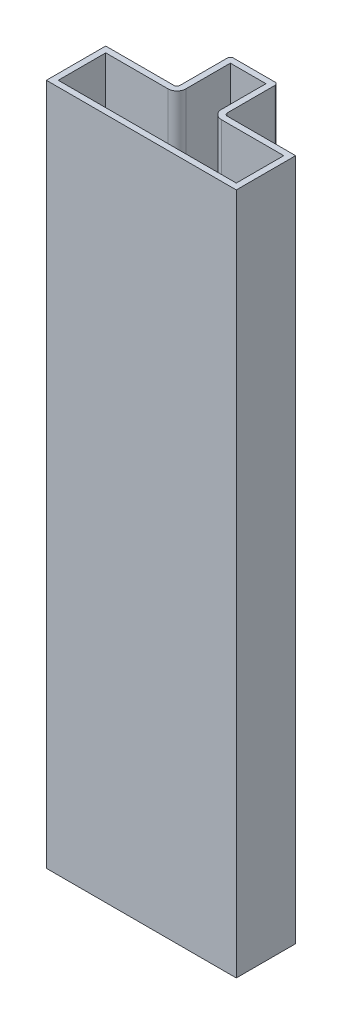
ISO-10303-21;
HEADER;
FILE_DESCRIPTION(('STEP AP214'),'2;1');
FILE_NAME('part.step','',(''),(''),'','','');
FILE_SCHEMA(('AUTOMOTIVE_DESIGN { 1 0 10303 214 1 1 1 1 }'));
ENDSEC;
DATA;
#1=APPLICATION_CONTEXT('core data for automotive mechanical design processes');
#2=APPLICATION_PROTOCOL_DEFINITION('international standard','automotive_design',2000,#1);
#3=PRODUCT_CONTEXT('',#1,'mechanical');
#4=PRODUCT('Part','Part','',(#3));
#5=PRODUCT_RELATED_PRODUCT_CATEGORY('part','',(#4));
#6=PRODUCT_DEFINITION_FORMATION('','',#4);
#7=PRODUCT_DEFINITION_CONTEXT('part definition',#1,'design');
#8=PRODUCT_DEFINITION('design','',#6,#7);
#9=PRODUCT_DEFINITION_SHAPE('','',#8);
#10=(LENGTH_UNIT() NAMED_UNIT(*) SI_UNIT(.MILLI.,.METRE.));
#11=(NAMED_UNIT(*) PLANE_ANGLE_UNIT() SI_UNIT($,.RADIAN.));
#12=(NAMED_UNIT(*) SI_UNIT($,.STERADIAN.) SOLID_ANGLE_UNIT());
#13=UNCERTAINTY_MEASURE_WITH_UNIT(LENGTH_MEASURE(1.E-05),#10,'distance_accuracy_value','');
#14=(GEOMETRIC_REPRESENTATION_CONTEXT(3) GLOBAL_UNCERTAINTY_ASSIGNED_CONTEXT((#13)) GLOBAL_UNIT_ASSIGNED_CONTEXT((#10,
#11,#12)) REPRESENTATION_CONTEXT('',''));
#15=CARTESIAN_POINT('',(0.,0.,0.));
#16=DIRECTION('',(0.,0.,1.));
#17=DIRECTION('',(1.,0.,0.));
#18=AXIS2_PLACEMENT_3D('',#15,#16,#17);
#19=CARTESIAN_POINT('',(0.,115.,-10.));
#20=DIRECTION('',(1.,0.,0.));
#21=DIRECTION('',(0.,0.,-1.));
#22=AXIS2_PLACEMENT_3D('',#19,#20,#21);
#23=PLANE('',#22);
#24=DIRECTION('',(0.,0.,1.));
#25=VECTOR('',#24,1.);
#26=CARTESIAN_POINT('',(0.,0.,-10.));
#27=LINE('',#26,#25);
#28=CARTESIAN_POINT('',(0.,0.,-10.));
#29=VERTEX_POINT('',#28);
#30=CARTESIAN_POINT('',(0.,0.,0.));
#31=VERTEX_POINT('',#30);
#32=EDGE_CURVE('E312',#29,#31,#27,.T.);
#33=ORIENTED_EDGE('',*,*,#32,.T.);
#34=DIRECTION('',(0.,-1.,0.));
#35=VECTOR('',#34,1.);
#36=CARTESIAN_POINT('',(0.,115.,0.));
#37=LINE('',#36,#35);
#38=CARTESIAN_POINT('',(0.,115.,0.));
#39=VERTEX_POINT('',#38);
#40=EDGE_CURVE('E372',#39,#31,#37,.T.);
#41=ORIENTED_EDGE('',*,*,#40,.F.);
#42=DIRECTION('',(0.,0.,1.));
#43=VECTOR('',#42,1.);
#44=CARTESIAN_POINT('',(0.,115.,-10.));
#45=LINE('',#44,#43);
#46=CARTESIAN_POINT('',(0.,115.,-10.));
#47=VERTEX_POINT('',#46);
#48=EDGE_CURVE('E322',#47,#39,#45,.T.);
#49=ORIENTED_EDGE('',*,*,#48,.F.);
#50=DIRECTION('',(0.,-1.,0.));
#51=VECTOR('',#50,1.);
#52=CARTESIAN_POINT('',(0.,115.,-10.));
#53=LINE('',#52,#51);
#54=EDGE_CURVE('E344',#47,#29,#53,.T.);
#55=ORIENTED_EDGE('',*,*,#54,.T.);
#56=EDGE_LOOP('',(#33,#41,#49,#55));
#57=FACE_BOUND('',#56,.T.);
#58=ADVANCED_FACE('F39',(#57),#23,.F.);
#59=CARTESIAN_POINT('',(0.,115.,0.));
#60=DIRECTION('',(0.,0.,-1.));
#61=DIRECTION('',(-1.,0.,0.));
#62=AXIS2_PLACEMENT_3D('',#59,#60,#61);
#63=PLANE('',#62);
#64=DIRECTION('',(1.,0.,0.));
#65=VECTOR('',#64,1.);
#66=CARTESIAN_POINT('',(0.,0.,0.));
#67=LINE('',#66,#65);
#68=CARTESIAN_POINT('',(32.,0.,0.));
#69=VERTEX_POINT('',#68);
#70=EDGE_CURVE('E347',#31,#69,#67,.T.);
#71=ORIENTED_EDGE('',*,*,#70,.T.);
#72=DIRECTION('',(0.,-1.,0.));
#73=VECTOR('',#72,1.);
#74=CARTESIAN_POINT('',(32.,115.,0.));
#75=LINE('',#74,#73);
#76=CARTESIAN_POINT('',(32.,115.,0.));
#77=VERTEX_POINT('',#76);
#78=EDGE_CURVE('E369',#77,#69,#75,.T.);
#79=ORIENTED_EDGE('',*,*,#78,.F.);
#80=DIRECTION('',(1.,0.,0.));
#81=VECTOR('',#80,1.);
#82=CARTESIAN_POINT('',(0.,115.,0.));
#83=LINE('',#82,#81);
#84=EDGE_CURVE('E325',#39,#77,#83,.T.);
#85=ORIENTED_EDGE('',*,*,#84,.F.);
#86=ORIENTED_EDGE('',*,*,#40,.T.);
#87=EDGE_LOOP('',(#71,#79,#85,#86));
#88=FACE_BOUND('',#87,.T.);
#89=ADVANCED_FACE('F459',(#88),#63,.F.);
#90=CARTESIAN_POINT('',(32.,115.,0.));
#91=DIRECTION('',(-1.,0.,0.));
#92=DIRECTION('',(0.,0.,1.));
#93=AXIS2_PLACEMENT_3D('',#90,#91,#92);
#94=PLANE('',#93);
#95=DIRECTION('',(0.,0.,-1.));
#96=VECTOR('',#95,1.);
#97=CARTESIAN_POINT('',(32.,0.,0.));
#98=LINE('',#97,#96);
#99=CARTESIAN_POINT('',(32.,0.,-10.));
#100=VERTEX_POINT('',#99);
#101=EDGE_CURVE('E349',#69,#100,#98,.T.);
#102=ORIENTED_EDGE('',*,*,#101,.T.);
#103=DIRECTION('',(0.,-1.,0.));
#104=VECTOR('',#103,1.);
#105=CARTESIAN_POINT('',(32.,115.,-10.));
#106=LINE('',#105,#104);
#107=CARTESIAN_POINT('',(32.,115.,-10.));
#108=VERTEX_POINT('',#107);
#109=EDGE_CURVE('E366',#108,#100,#106,.T.);
#110=ORIENTED_EDGE('',*,*,#109,.F.);
#111=DIRECTION('',(0.,0.,-1.));
#112=VECTOR('',#111,1.);
#113=CARTESIAN_POINT('',(32.,115.,0.));
#114=LINE('',#113,#112);
#115=EDGE_CURVE('E328',#77,#108,#114,.T.);
#116=ORIENTED_EDGE('',*,*,#115,.F.);
#117=ORIENTED_EDGE('',*,*,#78,.T.);
#118=EDGE_LOOP('',(#102,#110,#116,#117));
#119=FACE_BOUND('',#118,.T.);
#120=ADVANCED_FACE('F461',(#119),#94,.F.);
#121=CARTESIAN_POINT('',(32.,115.,-10.));
#122=DIRECTION('',(0.,0.,1.));
#123=DIRECTION('',(1.,0.,0.));
#124=AXIS2_PLACEMENT_3D('',#121,#122,#123);
#125=PLANE('',#124);
#126=DIRECTION('',(-1.,0.,0.));
#127=VECTOR('',#126,1.);
#128=CARTESIAN_POINT('',(32.,0.,-10.));
#129=LINE('',#128,#127);
#130=CARTESIAN_POINT('',(20.5,0.,-10.));
#131=VERTEX_POINT('',#130);
#132=EDGE_CURVE('E351',#100,#131,#129,.T.);
#133=ORIENTED_EDGE('',*,*,#132,.T.);
#134=DIRECTION('',(0.,-1.,0.));
#135=VECTOR('',#134,1.);
#136=CARTESIAN_POINT('',(20.5,115.,-10.));
#137=LINE('',#136,#135);
#138=CARTESIAN_POINT('',(20.5,115.,-10.));
#139=VERTEX_POINT('',#138);
#140=EDGE_CURVE('E388',#131,#139,#137,.F.);
#141=ORIENTED_EDGE('',*,*,#140,.T.);
#142=DIRECTION('',(-1.,0.,0.));
#143=VECTOR('',#142,1.);
#144=CARTESIAN_POINT('',(32.,115.,-10.));
#145=LINE('',#144,#143);
#146=EDGE_CURVE('E330',#108,#139,#145,.T.);
#147=ORIENTED_EDGE('',*,*,#146,.F.);
#148=ORIENTED_EDGE('',*,*,#109,.T.);
#149=EDGE_LOOP('',(#133,#141,#147,#148));
#150=FACE_BOUND('',#149,.T.);
#151=ADVANCED_FACE('F416',(#150),#125,.F.);
#152=CARTESIAN_POINT('',(20.,115.,-10.));
#153=DIRECTION('',(-1.,0.,0.));
#154=DIRECTION('',(0.,0.,1.));
#155=AXIS2_PLACEMENT_3D('',#152,#153,#154);
#156=PLANE('',#155);
#157=DIRECTION('',(0.,0.,-1.));
#158=VECTOR('',#157,1.);
#159=CARTESIAN_POINT('',(20.,115.,-10.));
#160=LINE('',#159,#158);
#161=CARTESIAN_POINT('',(20.,115.,-10.5));
#162=VERTEX_POINT('',#161);
#163=CARTESIAN_POINT('',(20.,115.,-18.5));
#164=VERTEX_POINT('',#163);
#165=EDGE_CURVE('E333',#162,#164,#160,.T.);
#166=ORIENTED_EDGE('',*,*,#165,.F.);
#167=DIRECTION('',(0.,-1.,0.));
#168=VECTOR('',#167,1.);
#169=CARTESIAN_POINT('',(20.,0.,-10.5));
#170=LINE('',#169,#168);
#171=CARTESIAN_POINT('',(20.,0.,-10.5));
#172=VERTEX_POINT('',#171);
#173=EDGE_CURVE('E385',#162,#172,#170,.T.);
#174=ORIENTED_EDGE('',*,*,#173,.T.);
#175=DIRECTION('',(0.,0.,-1.));
#176=VECTOR('',#175,1.);
#177=CARTESIAN_POINT('',(20.,0.,-10.));
#178=LINE('',#177,#176);
#179=CARTESIAN_POINT('',(20.,0.,-18.5));
#180=VERTEX_POINT('',#179);
#181=EDGE_CURVE('E354',#172,#180,#178,.T.);
#182=ORIENTED_EDGE('',*,*,#181,.T.);
#183=DIRECTION('',(0.,-1.,0.));
#184=VECTOR('',#183,1.);
#185=CARTESIAN_POINT('',(20.,115.,-18.5));
#186=LINE('',#185,#184);
#187=EDGE_CURVE('E383',#180,#164,#186,.F.);
#188=ORIENTED_EDGE('',*,*,#187,.T.);
#189=EDGE_LOOP('',(#166,#174,#182,#188));
#190=FACE_BOUND('',#189,.T.);
#191=ADVANCED_FACE('F426',(#190),#156,.F.);
#192=CARTESIAN_POINT('',(20.,115.,-19.));
#193=DIRECTION('',(0.,0.,1.));
#194=DIRECTION('',(1.,0.,0.));
#195=AXIS2_PLACEMENT_3D('',#192,#193,#194);
#196=PLANE('',#195);
#197=DIRECTION('',(-1.,0.,0.));
#198=VECTOR('',#197,1.);
#199=CARTESIAN_POINT('',(20.,0.,-19.));
#200=LINE('',#199,#198);
#201=CARTESIAN_POINT('',(19.5,0.,-19.));
#202=VERTEX_POINT('',#201);
#203=CARTESIAN_POINT('',(12.5,0.,-19.));
#204=VERTEX_POINT('',#203);
#205=EDGE_CURVE('E357',#202,#204,#200,.T.);
#206=ORIENTED_EDGE('',*,*,#205,.T.);
#207=DIRECTION('',(0.,-1.,0.));
#208=VECTOR('',#207,1.);
#209=CARTESIAN_POINT('',(12.5,115.,-19.));
#210=LINE('',#209,#208);
#211=CARTESIAN_POINT('',(12.5,115.,-19.));
#212=VERTEX_POINT('',#211);
#213=EDGE_CURVE('E397',#204,#212,#210,.F.);
#214=ORIENTED_EDGE('',*,*,#213,.T.);
#215=DIRECTION('',(-1.,0.,0.));
#216=VECTOR('',#215,1.);
#217=CARTESIAN_POINT('',(20.,115.,-19.));
#218=LINE('',#217,#216);
#219=CARTESIAN_POINT('',(19.5,115.,-19.));
#220=VERTEX_POINT('',#219);
#221=EDGE_CURVE('E336',#220,#212,#218,.T.);
#222=ORIENTED_EDGE('',*,*,#221,.F.);
#223=DIRECTION('',(0.,-1.,0.));
#224=VECTOR('',#223,1.);
#225=CARTESIAN_POINT('',(19.5,115.,-19.));
#226=LINE('',#225,#224);
#227=EDGE_CURVE('E394',#220,#202,#226,.T.);
#228=ORIENTED_EDGE('',*,*,#227,.T.);
#229=EDGE_LOOP('',(#206,#214,#222,#228));
#230=FACE_BOUND('',#229,.T.);
#231=ADVANCED_FACE('F433',(#230),#196,.F.);
#232=CARTESIAN_POINT('',(12.,115.,-19.));
#233=DIRECTION('',(1.,0.,0.));
#234=DIRECTION('',(0.,0.,-1.));
#235=AXIS2_PLACEMENT_3D('',#232,#233,#234);
#236=PLANE('',#235);
#237=DIRECTION('',(0.,0.,1.));
#238=VECTOR('',#237,1.);
#239=CARTESIAN_POINT('',(12.,0.,-19.));
#240=LINE('',#239,#238);
#241=CARTESIAN_POINT('',(12.,0.,-18.5));
#242=VERTEX_POINT('',#241);
#243=CARTESIAN_POINT('',(12.,0.,-10.5));
#244=VERTEX_POINT('',#243);
#245=EDGE_CURVE('E360',#242,#244,#240,.T.);
#246=ORIENTED_EDGE('',*,*,#245,.T.);
#247=DIRECTION('',(0.,-1.,0.));
#248=VECTOR('',#247,1.);
#249=CARTESIAN_POINT('',(12.,115.,-10.5));
#250=LINE('',#249,#248);
#251=CARTESIAN_POINT('',(12.,115.,-10.5));
#252=VERTEX_POINT('',#251);
#253=EDGE_CURVE('E381',#244,#252,#250,.F.);
#254=ORIENTED_EDGE('',*,*,#253,.T.);
#255=DIRECTION('',(0.,0.,1.));
#256=VECTOR('',#255,1.);
#257=CARTESIAN_POINT('',(12.,115.,-19.));
#258=LINE('',#257,#256);
#259=CARTESIAN_POINT('',(12.,115.,-18.5));
#260=VERTEX_POINT('',#259);
#261=EDGE_CURVE('E339',#260,#252,#258,.T.);
#262=ORIENTED_EDGE('',*,*,#261,.F.);
#263=DIRECTION('',(0.,-1.,0.));
#264=VECTOR('',#263,1.);
#265=CARTESIAN_POINT('',(12.,115.,-18.5));
#266=LINE('',#265,#264);
#267=EDGE_CURVE('E378',#260,#242,#266,.T.);
#268=ORIENTED_EDGE('',*,*,#267,.T.);
#269=EDGE_LOOP('',(#246,#254,#262,#268));
#270=FACE_BOUND('',#269,.T.);
#271=ADVANCED_FACE('F442',(#270),#236,.F.);
#272=CARTESIAN_POINT('',(12.,115.,-10.));
#273=DIRECTION('',(0.,0.,1.));
#274=DIRECTION('',(1.,0.,0.));
#275=AXIS2_PLACEMENT_3D('',#272,#273,#274);
#276=PLANE('',#275);
#277=DIRECTION('',(-1.,0.,0.));
#278=VECTOR('',#277,1.);
#279=CARTESIAN_POINT('',(12.,115.,-10.));
#280=LINE('',#279,#278);
#281=CARTESIAN_POINT('',(11.5,115.,-10.));
#282=VERTEX_POINT('',#281);
#283=EDGE_CURVE('E342',#282,#47,#280,.T.);
#284=ORIENTED_EDGE('',*,*,#283,.F.);
#285=DIRECTION('',(0.,-1.,0.));
#286=VECTOR('',#285,1.);
#287=CARTESIAN_POINT('',(11.5,0.,-10.));
#288=LINE('',#287,#286);
#289=CARTESIAN_POINT('',(11.5,0.,-10.));
#290=VERTEX_POINT('',#289);
#291=EDGE_CURVE('E375',#282,#290,#288,.T.);
#292=ORIENTED_EDGE('',*,*,#291,.T.);
#293=DIRECTION('',(-1.,0.,0.));
#294=VECTOR('',#293,1.);
#295=CARTESIAN_POINT('',(12.,0.,-10.));
#296=LINE('',#295,#294);
#297=EDGE_CURVE('E326',#290,#29,#296,.T.);
#298=ORIENTED_EDGE('',*,*,#297,.T.);
#299=ORIENTED_EDGE('',*,*,#54,.F.);
#300=EDGE_LOOP('',(#284,#292,#298,#299));
#301=FACE_BOUND('',#300,.T.);
#302=ADVANCED_FACE('F450',(#301),#276,.F.);
#303=CARTESIAN_POINT('',(0.,115.,0.));
#304=DIRECTION('',(0.,1.,0.));
#305=DIRECTION('',(0.,0.,1.));
#306=AXIS2_PLACEMENT_3D('',#303,#304,#305);
#307=PLANE('',#306);
#308=DIRECTION('',(-1.,0.,0.));
#309=VECTOR('',#308,1.);
#310=CARTESIAN_POINT('',(20.,115.,-18.));
#311=LINE('',#310,#309);
#312=CARTESIAN_POINT('',(19.,115.,-18.));
#313=VERTEX_POINT('',#312);
#314=CARTESIAN_POINT('',(13.,115.,-18.));
#315=VERTEX_POINT('',#314);
#316=EDGE_CURVE('E314',#313,#315,#311,.T.);
#317=ORIENTED_EDGE('',*,*,#316,.F.);
#318=DIRECTION('',(0.,0.,-1.));
#319=VECTOR('',#318,1.);
#320=CARTESIAN_POINT('',(19.,115.,-10.));
#321=LINE('',#320,#319);
#322=CARTESIAN_POINT('',(19.,115.,-10.5));
#323=VERTEX_POINT('',#322);
#324=EDGE_CURVE('E310',#323,#313,#321,.T.);
#325=ORIENTED_EDGE('',*,*,#324,.F.);
#326=CARTESIAN_POINT('',(20.5,115.,-10.5));
#327=DIRECTION('',(0.,1.,0.));
#328=DIRECTION('',(0.,0.,1.));
#329=AXIS2_PLACEMENT_3D('',#326,#327,#328);
#330=CIRCLE('',#329,1.5);
#331=CARTESIAN_POINT('',(20.5,115.,-9.));
#332=VERTEX_POINT('',#331);
#333=EDGE_CURVE('E288',#332,#323,#330,.F.);
#334=ORIENTED_EDGE('',*,*,#333,.F.);
#335=DIRECTION('',(-1.,0.,0.));
#336=VECTOR('',#335,1.);
#337=CARTESIAN_POINT('',(32.,115.,-9.));
#338=LINE('',#337,#336);
#339=CARTESIAN_POINT('',(31.,115.,-9.));
#340=VERTEX_POINT('',#339);
#341=EDGE_CURVE('E307',#340,#332,#338,.T.);
#342=ORIENTED_EDGE('',*,*,#341,.F.);
#343=DIRECTION('',(0.,0.,-1.));
#344=VECTOR('',#343,1.);
#345=CARTESIAN_POINT('',(31.,115.,0.));
#346=LINE('',#345,#344);
#347=CARTESIAN_POINT('',(31.,115.,-1.));
#348=VERTEX_POINT('',#347);
#349=EDGE_CURVE('E305',#348,#340,#346,.T.);
#350=ORIENTED_EDGE('',*,*,#349,.F.);
#351=DIRECTION('',(1.,0.,0.));
#352=VECTOR('',#351,1.);
#353=CARTESIAN_POINT('',(0.,115.,-1.));
#354=LINE('',#353,#352);
#355=CARTESIAN_POINT('',(1.,115.,-1.));
#356=VERTEX_POINT('',#355);
#357=EDGE_CURVE('E303',#356,#348,#354,.T.);
#358=ORIENTED_EDGE('',*,*,#357,.F.);
#359=DIRECTION('',(0.,0.,1.));
#360=VECTOR('',#359,1.);
#361=CARTESIAN_POINT('',(1.00000000000002,115.,-10.));
#362=LINE('',#361,#360);
#363=CARTESIAN_POINT('',(1.00000000000002,115.,-9.));
#364=VERTEX_POINT('',#363);
#365=EDGE_CURVE('E291',#364,#356,#362,.T.);
#366=ORIENTED_EDGE('',*,*,#365,.F.);
#367=DIRECTION('',(-1.,0.,0.));
#368=VECTOR('',#367,1.);
#369=CARTESIAN_POINT('',(12.,115.,-9.));
#370=LINE('',#369,#368);
#371=CARTESIAN_POINT('',(11.5,115.,-9.));
#372=VERTEX_POINT('',#371);
#373=EDGE_CURVE('E264',#372,#364,#370,.T.);
#374=ORIENTED_EDGE('',*,*,#373,.F.);
#375=CARTESIAN_POINT('',(11.5,115.,-10.5));
#376=DIRECTION('',(0.,1.,0.));
#377=DIRECTION('',(0.,0.,1.));
#378=AXIS2_PLACEMENT_3D('',#375,#376,#377);
#379=CIRCLE('',#378,1.5);
#380=CARTESIAN_POINT('',(13.,115.,-10.5));
#381=VERTEX_POINT('',#380);
#382=EDGE_CURVE('E289',#381,#372,#379,.F.);
#383=ORIENTED_EDGE('',*,*,#382,.F.);
#384=DIRECTION('',(0.,0.,1.));
#385=VECTOR('',#384,1.);
#386=CARTESIAN_POINT('',(13.,115.,-19.));
#387=LINE('',#386,#385);
#388=EDGE_CURVE('E317',#315,#381,#387,.T.);
#389=ORIENTED_EDGE('',*,*,#388,.F.);
#390=EDGE_LOOP('',(#317,#325,#334,#342,#350,#358,#366,#374,#383,#389));
#391=FACE_BOUND('',#390,.T.);
#392=ORIENTED_EDGE('',*,*,#221,.T.);
#393=CARTESIAN_POINT('',(12.5,115.,-18.5));
#394=DIRECTION('',(0.,1.,0.));
#395=DIRECTION('',(0.,0.,1.));
#396=AXIS2_PLACEMENT_3D('',#393,#394,#395);
#397=CIRCLE('',#396,0.5);
#398=EDGE_CURVE('E401',#212,#260,#397,.T.);
#399=ORIENTED_EDGE('',*,*,#398,.T.);
#400=ORIENTED_EDGE('',*,*,#261,.T.);
#401=CARTESIAN_POINT('',(11.5,115.,-10.5));
#402=DIRECTION('',(0.,1.,0.));
#403=DIRECTION('',(0.,0.,1.));
#404=AXIS2_PLACEMENT_3D('',#401,#402,#403);
#405=CIRCLE('',#404,0.5);
#406=EDGE_CURVE('E405',#252,#282,#405,.F.);
#407=ORIENTED_EDGE('',*,*,#406,.T.);
#408=ORIENTED_EDGE('',*,*,#283,.T.);
#409=ORIENTED_EDGE('',*,*,#48,.T.);
#410=ORIENTED_EDGE('',*,*,#84,.T.);
#411=ORIENTED_EDGE('',*,*,#115,.T.);
#412=ORIENTED_EDGE('',*,*,#146,.T.);
#413=CARTESIAN_POINT('',(20.5,115.,-10.5));
#414=DIRECTION('',(0.,1.,0.));
#415=DIRECTION('',(0.,0.,1.));
#416=AXIS2_PLACEMENT_3D('',#413,#414,#415);
#417=CIRCLE('',#416,0.5);
#418=EDGE_CURVE('E11',#139,#162,#417,.F.);
#419=ORIENTED_EDGE('',*,*,#418,.T.);
#420=ORIENTED_EDGE('',*,*,#165,.T.);
#421=CARTESIAN_POINT('',(19.5,115.,-18.5));
#422=DIRECTION('',(0.,1.,0.));
#423=DIRECTION('',(0.,0.,1.));
#424=AXIS2_PLACEMENT_3D('',#421,#422,#423);
#425=CIRCLE('',#424,0.5);
#426=EDGE_CURVE('E399',#164,#220,#425,.T.);
#427=ORIENTED_EDGE('',*,*,#426,.T.);
#428=EDGE_LOOP('',(#392,#399,#400,#407,#408,#409,#410,#411,#412,#419,#420,#427));
#429=FACE_BOUND('',#428,.T.);
#430=ADVANCED_FACE('F423',(#391,#429),#307,.T.);
#431=CARTESIAN_POINT('',(0.,0.,0.));
#432=DIRECTION('',(0.,1.,0.));
#433=DIRECTION('',(0.,0.,1.));
#434=AXIS2_PLACEMENT_3D('',#431,#432,#433);
#435=PLANE('',#434);
#436=DIRECTION('',(-1.,0.,0.));
#437=VECTOR('',#436,1.);
#438=CARTESIAN_POINT('',(14.5,0.,-3.));
#439=LINE('',#438,#437);
#440=CARTESIAN_POINT('',(17.5,0.,-3.));
#441=VERTEX_POINT('',#440);
#442=CARTESIAN_POINT('',(14.5,0.,-3.));
#443=VERTEX_POINT('',#442);
#444=EDGE_CURVE('E242',#441,#443,#439,.T.);
#445=ORIENTED_EDGE('',*,*,#444,.F.);
#446=DIRECTION('',(0.,0.,1.));
#447=VECTOR('',#446,1.);
#448=CARTESIAN_POINT('',(17.5,0.,-3.));
#449=LINE('',#448,#447);
#450=CARTESIAN_POINT('',(17.5,0.,-7.));
#451=VERTEX_POINT('',#450);
#452=EDGE_CURVE('E54',#451,#441,#449,.T.);
#453=ORIENTED_EDGE('',*,*,#452,.F.);
#454=DIRECTION('',(1.,0.,0.));
#455=VECTOR('',#454,1.);
#456=CARTESIAN_POINT('',(14.5,0.,-7.));
#457=LINE('',#456,#455);
#458=CARTESIAN_POINT('',(14.5,0.,-7.));
#459=VERTEX_POINT('',#458);
#460=EDGE_CURVE('E233',#459,#451,#457,.T.);
#461=ORIENTED_EDGE('',*,*,#460,.F.);
#462=DIRECTION('',(0.,0.,-1.));
#463=VECTOR('',#462,1.);
#464=CARTESIAN_POINT('',(14.5,0.,-3.));
#465=LINE('',#464,#463);
#466=EDGE_CURVE('E236',#443,#459,#465,.T.);
#467=ORIENTED_EDGE('',*,*,#466,.F.);
#468=EDGE_LOOP('',(#445,#453,#461,#467));
#469=FACE_BOUND('',#468,.T.);
#470=ORIENTED_EDGE('',*,*,#245,.F.);
#471=CARTESIAN_POINT('',(12.5,0.,-18.5));
#472=DIRECTION('',(0.,1.,0.));
#473=DIRECTION('',(0.,0.,1.));
#474=AXIS2_PLACEMENT_3D('',#471,#472,#473);
#475=CIRCLE('',#474,0.5);
#476=EDGE_CURVE('E392',#242,#204,#475,.F.);
#477=ORIENTED_EDGE('',*,*,#476,.T.);
#478=ORIENTED_EDGE('',*,*,#205,.F.);
#479=CARTESIAN_POINT('',(19.5,0.,-18.5));
#480=DIRECTION('',(0.,1.,0.));
#481=DIRECTION('',(0.,0.,1.));
#482=AXIS2_PLACEMENT_3D('',#479,#480,#481);
#483=CIRCLE('',#482,0.5);
#484=EDGE_CURVE('E390',#202,#180,#483,.F.);
#485=ORIENTED_EDGE('',*,*,#484,.T.);
#486=ORIENTED_EDGE('',*,*,#181,.F.);
#487=CARTESIAN_POINT('',(20.5,0.,-10.5));
#488=DIRECTION('',(0.,1.,0.));
#489=DIRECTION('',(0.,0.,1.));
#490=AXIS2_PLACEMENT_3D('',#487,#488,#489);
#491=CIRCLE('',#490,0.5);
#492=EDGE_CURVE('E47',#172,#131,#491,.T.);
#493=ORIENTED_EDGE('',*,*,#492,.T.);
#494=ORIENTED_EDGE('',*,*,#132,.F.);
#495=ORIENTED_EDGE('',*,*,#101,.F.);
#496=ORIENTED_EDGE('',*,*,#70,.F.);
#497=ORIENTED_EDGE('',*,*,#32,.F.);
#498=ORIENTED_EDGE('',*,*,#297,.F.);
#499=CARTESIAN_POINT('',(11.5,0.,-10.5));
#500=DIRECTION('',(0.,1.,0.));
#501=DIRECTION('',(0.,0.,1.));
#502=AXIS2_PLACEMENT_3D('',#499,#500,#501);
#503=CIRCLE('',#502,0.5);
#504=EDGE_CURVE('E403',#290,#244,#503,.T.);
#505=ORIENTED_EDGE('',*,*,#504,.T.);
#506=EDGE_LOOP('',(#470,#477,#478,#485,#486,#493,#494,#495,#496,#497,#498,#505));
#507=FACE_BOUND('',#506,.T.);
#508=ADVANCED_FACE('F410',(#469,#507),#435,.F.);
#509=CARTESIAN_POINT('',(11.5,115.,-10.5));
#510=DIRECTION('',(0.,1.,0.));
#511=DIRECTION('',(0.,0.,1.));
#512=AXIS2_PLACEMENT_3D('',#509,#510,#511);
#513=CYLINDRICAL_SURFACE('',#512,0.5);
#514=ORIENTED_EDGE('',*,*,#406,.F.);
#515=ORIENTED_EDGE('',*,*,#253,.F.);
#516=ORIENTED_EDGE('',*,*,#504,.F.);
#517=ORIENTED_EDGE('',*,*,#291,.F.);
#518=EDGE_LOOP('',(#514,#515,#516,#517));
#519=FACE_BOUND('',#518,.T.);
#520=ADVANCED_FACE('F445',(#519),#513,.F.);
#521=CARTESIAN_POINT('',(20.5,115.,-10.5));
#522=DIRECTION('',(0.,1.,0.));
#523=DIRECTION('',(0.,0.,1.));
#524=AXIS2_PLACEMENT_3D('',#521,#522,#523);
#525=CYLINDRICAL_SURFACE('',#524,0.5);
#526=ORIENTED_EDGE('',*,*,#418,.F.);
#527=ORIENTED_EDGE('',*,*,#140,.F.);
#528=ORIENTED_EDGE('',*,*,#492,.F.);
#529=ORIENTED_EDGE('',*,*,#173,.F.);
#530=EDGE_LOOP('',(#526,#527,#528,#529));
#531=FACE_BOUND('',#530,.T.);
#532=ADVANCED_FACE('F420',(#531),#525,.F.);
#533=CARTESIAN_POINT('',(12.5,115.,-18.5));
#534=DIRECTION('',(0.,-1.,0.));
#535=DIRECTION('',(0.,0.,-1.));
#536=AXIS2_PLACEMENT_3D('',#533,#534,#535);
#537=CYLINDRICAL_SURFACE('',#536,0.5);
#538=ORIENTED_EDGE('',*,*,#398,.F.);
#539=ORIENTED_EDGE('',*,*,#213,.F.);
#540=ORIENTED_EDGE('',*,*,#476,.F.);
#541=ORIENTED_EDGE('',*,*,#267,.F.);
#542=EDGE_LOOP('',(#538,#539,#540,#541));
#543=FACE_BOUND('',#542,.T.);
#544=ADVANCED_FACE('F437',(#543),#537,.T.);
#545=CARTESIAN_POINT('',(19.5,115.,-18.5));
#546=DIRECTION('',(0.,-1.,0.));
#547=DIRECTION('',(0.,0.,-1.));
#548=AXIS2_PLACEMENT_3D('',#545,#546,#547);
#549=CYLINDRICAL_SURFACE('',#548,0.5);
#550=ORIENTED_EDGE('',*,*,#426,.F.);
#551=ORIENTED_EDGE('',*,*,#187,.F.);
#552=ORIENTED_EDGE('',*,*,#484,.F.);
#553=ORIENTED_EDGE('',*,*,#227,.F.);
#554=EDGE_LOOP('',(#550,#551,#552,#553));
#555=FACE_BOUND('',#554,.T.);
#556=ADVANCED_FACE('F41',(#555),#549,.T.);
#557=CARTESIAN_POINT('',(1.00000000000002,115.,-10.));
#558=DIRECTION('',(1.,0.,0.));
#559=DIRECTION('',(0.,0.,-1.));
#560=AXIS2_PLACEMENT_3D('',#557,#558,#559);
#561=PLANE('',#560);
#562=DIRECTION('',(0.,0.,1.));
#563=VECTOR('',#562,1.);
#564=CARTESIAN_POINT('',(1.00000000000002,90.,-10.));
#565=LINE('',#564,#563);
#566=CARTESIAN_POINT('',(1.00000000000002,90.,-9.));
#567=VERTEX_POINT('',#566);
#568=CARTESIAN_POINT('',(1.,90.,-1.));
#569=VERTEX_POINT('',#568);
#570=EDGE_CURVE('E248',#567,#569,#565,.T.);
#571=ORIENTED_EDGE('',*,*,#570,.F.);
#572=DIRECTION('',(0.,-1.,0.));
#573=VECTOR('',#572,1.);
#574=CARTESIAN_POINT('',(1.00000000000002,115.,-9.));
#575=LINE('',#574,#573);
#576=EDGE_CURVE('E260',#364,#567,#575,.T.);
#577=ORIENTED_EDGE('',*,*,#576,.F.);
#578=ORIENTED_EDGE('',*,*,#365,.T.);
#579=DIRECTION('',(0.,-1.,0.));
#580=VECTOR('',#579,1.);
#581=CARTESIAN_POINT('',(1.,115.,-1.));
#582=LINE('',#581,#580);
#583=EDGE_CURVE('E255',#356,#569,#582,.T.);
#584=ORIENTED_EDGE('',*,*,#583,.T.);
#585=EDGE_LOOP('',(#571,#577,#578,#584));
#586=FACE_BOUND('',#585,.T.);
#587=ADVANCED_FACE('F482',(#586),#561,.T.);
#588=CARTESIAN_POINT('',(0.,115.,-1.));
#589=DIRECTION('',(0.,0.,-1.));
#590=DIRECTION('',(-1.,0.,0.));
#591=AXIS2_PLACEMENT_3D('',#588,#589,#590);
#592=PLANE('',#591);
#593=DIRECTION('',(1.,0.,0.));
#594=VECTOR('',#593,1.);
#595=CARTESIAN_POINT('',(0.,90.,-1.));
#596=LINE('',#595,#594);
#597=CARTESIAN_POINT('',(31.,90.,-1.));
#598=VERTEX_POINT('',#597);
#599=EDGE_CURVE('E254',#569,#598,#596,.T.);
#600=ORIENTED_EDGE('',*,*,#599,.F.);
#601=ORIENTED_EDGE('',*,*,#583,.F.);
#602=ORIENTED_EDGE('',*,*,#357,.T.);
#603=DIRECTION('',(0.,-1.,0.));
#604=VECTOR('',#603,1.);
#605=CARTESIAN_POINT('',(31.,115.,-1.));
#606=LINE('',#605,#604);
#607=EDGE_CURVE('E259',#348,#598,#606,.T.);
#608=ORIENTED_EDGE('',*,*,#607,.T.);
#609=EDGE_LOOP('',(#600,#601,#602,#608));
#610=FACE_BOUND('',#609,.T.);
#611=ADVANCED_FACE('F487',(#610),#592,.T.);
#612=CARTESIAN_POINT('',(31.,115.,0.));
#613=DIRECTION('',(-1.,0.,0.));
#614=DIRECTION('',(0.,0.,1.));
#615=AXIS2_PLACEMENT_3D('',#612,#613,#614);
#616=PLANE('',#615);
#617=DIRECTION('',(0.,0.,-1.));
#618=VECTOR('',#617,1.);
#619=CARTESIAN_POINT('',(31.,90.,0.));
#620=LINE('',#619,#618);
#621=CARTESIAN_POINT('',(31.,90.,-9.));
#622=VERTEX_POINT('',#621);
#623=EDGE_CURVE('E266',#598,#622,#620,.T.);
#624=ORIENTED_EDGE('',*,*,#623,.F.);
#625=ORIENTED_EDGE('',*,*,#607,.F.);
#626=ORIENTED_EDGE('',*,*,#349,.T.);
#627=DIRECTION('',(0.,-1.,0.));
#628=VECTOR('',#627,1.);
#629=CARTESIAN_POINT('',(31.,115.,-9.));
#630=LINE('',#629,#628);
#631=EDGE_CURVE('E263',#340,#622,#630,.T.);
#632=ORIENTED_EDGE('',*,*,#631,.T.);
#633=EDGE_LOOP('',(#624,#625,#626,#632));
#634=FACE_BOUND('',#633,.T.);
#635=ADVANCED_FACE('F493',(#634),#616,.T.);
#636=CARTESIAN_POINT('',(32.,115.,-9.));
#637=DIRECTION('',(0.,0.,1.));
#638=DIRECTION('',(1.,0.,0.));
#639=AXIS2_PLACEMENT_3D('',#636,#637,#638);
#640=PLANE('',#639);
#641=DIRECTION('',(-1.,0.,0.));
#642=VECTOR('',#641,1.);
#643=CARTESIAN_POINT('',(32.,90.,-9.));
#644=LINE('',#643,#642);
#645=CARTESIAN_POINT('',(20.5,90.,-9.));
#646=VERTEX_POINT('',#645);
#647=EDGE_CURVE('E270',#622,#646,#644,.T.);
#648=ORIENTED_EDGE('',*,*,#647,.F.);
#649=ORIENTED_EDGE('',*,*,#631,.F.);
#650=ORIENTED_EDGE('',*,*,#341,.T.);
#651=DIRECTION('',(0.,1.,0.));
#652=VECTOR('',#651,1.);
#653=CARTESIAN_POINT('',(20.5,115.,-9.));
#654=LINE('',#653,#652);
#655=EDGE_CURVE('E276',#646,#332,#654,.T.);
#656=ORIENTED_EDGE('',*,*,#655,.F.);
#657=EDGE_LOOP('',(#648,#649,#650,#656));
#658=FACE_BOUND('',#657,.T.);
#659=ADVANCED_FACE('F502',(#658),#640,.T.);
#660=CARTESIAN_POINT('',(19.,115.,-10.));
#661=DIRECTION('',(-1.,0.,0.));
#662=DIRECTION('',(0.,0.,1.));
#663=AXIS2_PLACEMENT_3D('',#660,#661,#662);
#664=PLANE('',#663);
#665=ORIENTED_EDGE('',*,*,#324,.T.);
#666=DIRECTION('',(0.,1.,0.));
#667=VECTOR('',#666,1.);
#668=CARTESIAN_POINT('',(19.,115.,-18.));
#669=LINE('',#668,#667);
#670=CARTESIAN_POINT('',(19.,90.,-18.));
#671=VERTEX_POINT('',#670);
#672=EDGE_CURVE('E295',#671,#313,#669,.T.);
#673=ORIENTED_EDGE('',*,*,#672,.F.);
#674=DIRECTION('',(0.,0.,-1.));
#675=VECTOR('',#674,1.);
#676=CARTESIAN_POINT('',(19.,90.,-10.));
#677=LINE('',#676,#675);
#678=CARTESIAN_POINT('',(19.,90.,-10.5));
#679=VERTEX_POINT('',#678);
#680=EDGE_CURVE('E275',#679,#671,#677,.T.);
#681=ORIENTED_EDGE('',*,*,#680,.F.);
#682=DIRECTION('',(0.,1.,0.));
#683=VECTOR('',#682,1.);
#684=CARTESIAN_POINT('',(19.,115.,-10.5));
#685=LINE('',#684,#683);
#686=EDGE_CURVE('E62',#323,#679,#685,.F.);
#687=ORIENTED_EDGE('',*,*,#686,.F.);
#688=EDGE_LOOP('',(#665,#673,#681,#687));
#689=FACE_BOUND('',#688,.T.);
#690=ADVANCED_FACE('F506',(#689),#664,.T.);
#691=CARTESIAN_POINT('',(20.,115.,-18.));
#692=DIRECTION('',(0.,0.,1.));
#693=DIRECTION('',(1.,0.,0.));
#694=AXIS2_PLACEMENT_3D('',#691,#692,#693);
#695=PLANE('',#694);
#696=DIRECTION('',(-1.,0.,0.));
#697=VECTOR('',#696,1.);
#698=CARTESIAN_POINT('',(20.,90.,-18.));
#699=LINE('',#698,#697);
#700=CARTESIAN_POINT('',(13.,90.,-18.));
#701=VERTEX_POINT('',#700);
#702=EDGE_CURVE('E283',#671,#701,#699,.T.);
#703=ORIENTED_EDGE('',*,*,#702,.F.);
#704=ORIENTED_EDGE('',*,*,#672,.T.);
#705=ORIENTED_EDGE('',*,*,#316,.T.);
#706=DIRECTION('',(0.,1.,0.));
#707=VECTOR('',#706,1.);
#708=CARTESIAN_POINT('',(13.,115.,-18.));
#709=LINE('',#708,#707);
#710=EDGE_CURVE('E278',#701,#315,#709,.T.);
#711=ORIENTED_EDGE('',*,*,#710,.F.);
#712=EDGE_LOOP('',(#703,#704,#705,#711));
#713=FACE_BOUND('',#712,.T.);
#714=ADVANCED_FACE('F510',(#713),#695,.T.);
#715=CARTESIAN_POINT('',(13.,115.,-19.));
#716=DIRECTION('',(1.,0.,0.));
#717=DIRECTION('',(0.,0.,-1.));
#718=AXIS2_PLACEMENT_3D('',#715,#716,#717);
#719=PLANE('',#718);
#720=DIRECTION('',(0.,0.,1.));
#721=VECTOR('',#720,1.);
#722=CARTESIAN_POINT('',(13.,90.,-19.));
#723=LINE('',#722,#721);
#724=CARTESIAN_POINT('',(13.,90.,-10.5));
#725=VERTEX_POINT('',#724);
#726=EDGE_CURVE('E279',#701,#725,#723,.T.);
#727=ORIENTED_EDGE('',*,*,#726,.F.);
#728=ORIENTED_EDGE('',*,*,#710,.T.);
#729=ORIENTED_EDGE('',*,*,#388,.T.);
#730=DIRECTION('',(0.,1.,0.));
#731=VECTOR('',#730,1.);
#732=CARTESIAN_POINT('',(13.,115.,-10.5));
#733=LINE('',#732,#731);
#734=EDGE_CURVE('E297',#725,#381,#733,.T.);
#735=ORIENTED_EDGE('',*,*,#734,.F.);
#736=EDGE_LOOP('',(#727,#728,#729,#735));
#737=FACE_BOUND('',#736,.T.);
#738=ADVANCED_FACE('F513',(#737),#719,.T.);
#739=CARTESIAN_POINT('',(12.,115.,-9.));
#740=DIRECTION('',(0.,0.,1.));
#741=DIRECTION('',(1.,0.,0.));
#742=AXIS2_PLACEMENT_3D('',#739,#740,#741);
#743=PLANE('',#742);
#744=ORIENTED_EDGE('',*,*,#373,.T.);
#745=ORIENTED_EDGE('',*,*,#576,.T.);
#746=DIRECTION('',(-1.,0.,0.));
#747=VECTOR('',#746,1.);
#748=CARTESIAN_POINT('',(12.,90.,-9.));
#749=LINE('',#748,#747);
#750=CARTESIAN_POINT('',(11.5,90.,-9.));
#751=VERTEX_POINT('',#750);
#752=EDGE_CURVE('E282',#751,#567,#749,.T.);
#753=ORIENTED_EDGE('',*,*,#752,.F.);
#754=DIRECTION('',(0.,1.,0.));
#755=VECTOR('',#754,1.);
#756=CARTESIAN_POINT('',(11.5,115.,-9.));
#757=LINE('',#756,#755);
#758=EDGE_CURVE('E258',#372,#751,#757,.F.);
#759=ORIENTED_EDGE('',*,*,#758,.F.);
#760=EDGE_LOOP('',(#744,#745,#753,#759));
#761=FACE_BOUND('',#760,.T.);
#762=ADVANCED_FACE('F517',(#761),#743,.T.);
#763=CARTESIAN_POINT('',(0.,90.,0.));
#764=DIRECTION('',(0.,1.,0.));
#765=DIRECTION('',(0.,0.,1.));
#766=AXIS2_PLACEMENT_3D('',#763,#764,#765);
#767=PLANE('',#766);
#768=ORIENTED_EDGE('',*,*,#726,.T.);
#769=CARTESIAN_POINT('',(11.5,90.,-10.5));
#770=DIRECTION('',(0.,1.,0.));
#771=DIRECTION('',(0.,0.,1.));
#772=AXIS2_PLACEMENT_3D('',#769,#770,#771);
#773=CIRCLE('',#772,1.5);
#774=EDGE_CURVE('E292',#751,#725,#773,.T.);
#775=ORIENTED_EDGE('',*,*,#774,.F.);
#776=ORIENTED_EDGE('',*,*,#752,.T.);
#777=ORIENTED_EDGE('',*,*,#570,.T.);
#778=ORIENTED_EDGE('',*,*,#599,.T.);
#779=ORIENTED_EDGE('',*,*,#623,.T.);
#780=ORIENTED_EDGE('',*,*,#647,.T.);
#781=CARTESIAN_POINT('',(20.5,90.,-10.5));
#782=DIRECTION('',(0.,1.,0.));
#783=DIRECTION('',(0.,0.,1.));
#784=AXIS2_PLACEMENT_3D('',#781,#782,#783);
#785=CIRCLE('',#784,1.5);
#786=EDGE_CURVE('E286',#679,#646,#785,.T.);
#787=ORIENTED_EDGE('',*,*,#786,.F.);
#788=ORIENTED_EDGE('',*,*,#680,.T.);
#789=ORIENTED_EDGE('',*,*,#702,.T.);
#790=EDGE_LOOP('',(#768,#775,#776,#777,#778,#779,#780,#787,#788,#789));
#791=FACE_BOUND('',#790,.T.);
#792=ADVANCED_FACE('F521',(#791),#767,.T.);
#793=CARTESIAN_POINT('',(11.5,115.,-10.5));
#794=DIRECTION('',(0.,1.,0.));
#795=DIRECTION('',(0.,0.,1.));
#796=AXIS2_PLACEMENT_3D('',#793,#794,#795);
#797=CYLINDRICAL_SURFACE('',#796,1.5);
#798=ORIENTED_EDGE('',*,*,#382,.T.);
#799=ORIENTED_EDGE('',*,*,#758,.T.);
#800=ORIENTED_EDGE('',*,*,#774,.T.);
#801=ORIENTED_EDGE('',*,*,#734,.T.);
#802=EDGE_LOOP('',(#798,#799,#800,#801));
#803=FACE_BOUND('',#802,.T.);
#804=ADVANCED_FACE('F525',(#803),#797,.T.);
#805=CARTESIAN_POINT('',(20.5,115.,-10.5));
#806=DIRECTION('',(0.,1.,0.));
#807=DIRECTION('',(0.,0.,1.));
#808=AXIS2_PLACEMENT_3D('',#805,#806,#807);
#809=CYLINDRICAL_SURFACE('',#808,1.5);
#810=ORIENTED_EDGE('',*,*,#333,.T.);
#811=ORIENTED_EDGE('',*,*,#686,.T.);
#812=ORIENTED_EDGE('',*,*,#786,.T.);
#813=ORIENTED_EDGE('',*,*,#655,.T.);
#814=EDGE_LOOP('',(#810,#811,#812,#813));
#815=FACE_BOUND('',#814,.T.);
#816=ADVANCED_FACE('F529',(#815),#809,.T.);
#817=CARTESIAN_POINT('',(17.5,3.,-3.));
#818=DIRECTION('',(1.,0.,0.));
#819=DIRECTION('',(0.,0.,-1.));
#820=AXIS2_PLACEMENT_3D('',#817,#818,#819);
#821=PLANE('',#820);
#822=ORIENTED_EDGE('',*,*,#452,.T.);
#823=DIRECTION('',(0.,-1.,0.));
#824=VECTOR('',#823,1.);
#825=CARTESIAN_POINT('',(17.5,3.,-3.));
#826=LINE('',#825,#824);
#827=CARTESIAN_POINT('',(17.5,3.,-3.));
#828=VERTEX_POINT('',#827);
#829=EDGE_CURVE('E211',#828,#441,#826,.T.);
#830=ORIENTED_EDGE('',*,*,#829,.F.);
#831=DIRECTION('',(0.,0.,1.));
#832=VECTOR('',#831,1.);
#833=CARTESIAN_POINT('',(17.5,3.,-3.));
#834=LINE('',#833,#832);
#835=CARTESIAN_POINT('',(17.5,3.,-7.));
#836=VERTEX_POINT('',#835);
#837=EDGE_CURVE('E215',#836,#828,#834,.T.);
#838=ORIENTED_EDGE('',*,*,#837,.F.);
#839=DIRECTION('',(0.,-1.,0.));
#840=VECTOR('',#839,1.);
#841=CARTESIAN_POINT('',(17.5,3.,-7.));
#842=LINE('',#841,#840);
#843=EDGE_CURVE('E246',#836,#451,#842,.T.);
#844=ORIENTED_EDGE('',*,*,#843,.T.);
#845=EDGE_LOOP('',(#822,#830,#838,#844));
#846=FACE_BOUND('',#845,.T.);
#847=ADVANCED_FACE('F213',(#846),#821,.F.);
#848=CARTESIAN_POINT('',(14.5,3.,-7.));
#849=DIRECTION('',(0.,0.,-1.));
#850=DIRECTION('',(-1.,0.,0.));
#851=AXIS2_PLACEMENT_3D('',#848,#849,#850);
#852=PLANE('',#851);
#853=ORIENTED_EDGE('',*,*,#460,.T.);
#854=ORIENTED_EDGE('',*,*,#843,.F.);
#855=DIRECTION('',(1.,0.,0.));
#856=VECTOR('',#855,1.);
#857=CARTESIAN_POINT('',(14.5,3.,-7.));
#858=LINE('',#857,#856);
#859=CARTESIAN_POINT('',(14.5,3.,-7.));
#860=VERTEX_POINT('',#859);
#861=EDGE_CURVE('E221',#860,#836,#858,.T.);
#862=ORIENTED_EDGE('',*,*,#861,.F.);
#863=DIRECTION('',(0.,-1.,0.));
#864=VECTOR('',#863,1.);
#865=CARTESIAN_POINT('',(14.5,3.,-7.));
#866=LINE('',#865,#864);
#867=EDGE_CURVE('E249',#860,#459,#866,.T.);
#868=ORIENTED_EDGE('',*,*,#867,.T.);
#869=EDGE_LOOP('',(#853,#854,#862,#868));
#870=FACE_BOUND('',#869,.T.);
#871=ADVANCED_FACE('F659',(#870),#852,.F.);
#872=CARTESIAN_POINT('',(14.5,3.,-3.));
#873=DIRECTION('',(-1.,0.,0.));
#874=DIRECTION('',(0.,0.,1.));
#875=AXIS2_PLACEMENT_3D('',#872,#873,#874);
#876=PLANE('',#875);
#877=ORIENTED_EDGE('',*,*,#466,.T.);
#878=ORIENTED_EDGE('',*,*,#867,.F.);
#879=DIRECTION('',(0.,0.,-1.));
#880=VECTOR('',#879,1.);
#881=CARTESIAN_POINT('',(14.5,3.,-3.));
#882=LINE('',#881,#880);
#883=CARTESIAN_POINT('',(14.5,3.,-3.));
#884=VERTEX_POINT('',#883);
#885=EDGE_CURVE('E229',#884,#860,#882,.T.);
#886=ORIENTED_EDGE('',*,*,#885,.F.);
#887=DIRECTION('',(0.,-1.,0.));
#888=VECTOR('',#887,1.);
#889=CARTESIAN_POINT('',(14.5,3.,-3.));
#890=LINE('',#889,#888);
#891=EDGE_CURVE('E220',#884,#443,#890,.T.);
#892=ORIENTED_EDGE('',*,*,#891,.T.);
#893=EDGE_LOOP('',(#877,#878,#886,#892));
#894=FACE_BOUND('',#893,.T.);
#895=ADVANCED_FACE('F667',(#894),#876,.F.);
#896=CARTESIAN_POINT('',(14.5,3.,-3.));
#897=DIRECTION('',(0.,0.,1.));
#898=DIRECTION('',(1.,0.,0.));
#899=AXIS2_PLACEMENT_3D('',#896,#897,#898);
#900=PLANE('',#899);
#901=ORIENTED_EDGE('',*,*,#444,.T.);
#902=ORIENTED_EDGE('',*,*,#891,.F.);
#903=DIRECTION('',(-1.,0.,0.));
#904=VECTOR('',#903,1.);
#905=CARTESIAN_POINT('',(14.5,3.,-3.));
#906=LINE('',#905,#904);
#907=EDGE_CURVE('E224',#828,#884,#906,.T.);
#908=ORIENTED_EDGE('',*,*,#907,.F.);
#909=ORIENTED_EDGE('',*,*,#829,.T.);
#910=EDGE_LOOP('',(#901,#902,#908,#909));
#911=FACE_BOUND('',#910,.T.);
#912=ADVANCED_FACE('F225',(#911),#900,.F.);
#913=CARTESIAN_POINT('',(0.,3.,0.));
#914=DIRECTION('',(0.,-1.,0.));
#915=DIRECTION('',(0.,0.,-1.));
#916=AXIS2_PLACEMENT_3D('',#913,#914,#915);
#917=PLANE('',#916);
#918=ORIENTED_EDGE('',*,*,#837,.T.);
#919=ORIENTED_EDGE('',*,*,#907,.T.);
#920=ORIENTED_EDGE('',*,*,#885,.T.);
#921=ORIENTED_EDGE('',*,*,#861,.T.);
#922=EDGE_LOOP('',(#918,#919,#920,#921));
#923=FACE_BOUND('',#922,.T.);
#924=ADVANCED_FACE('F231',(#923),#917,.T.);
#925=CLOSED_SHELL('',(#58,#89,#120,#151,#191,#231,#271,#302,#430,#508,#520,#532,#544,#556,#587,
#611,#635,#659,#690,#714,#738,#762,#792,#804,#816,#847,#871,#895,#912,#924));
#926=MANIFOLD_SOLID_BREP('B2',#925);
#927=ADVANCED_BREP_SHAPE_REPRESENTATION('',(#18,#926),#14);
#928=SHAPE_DEFINITION_REPRESENTATION(#9,#927);
ENDSEC;
END-ISO-10303-21;
